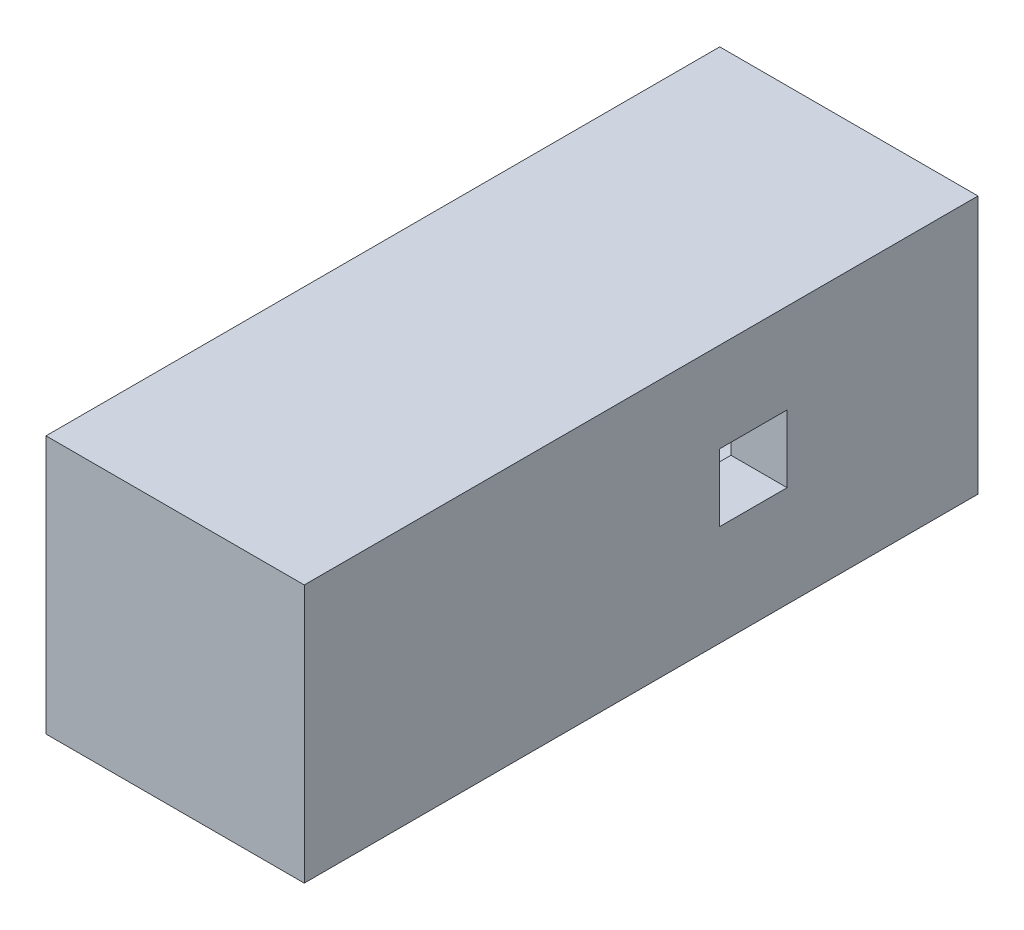
ISO-10303-21;
HEADER;
FILE_DESCRIPTION(('STEP AP214'),'2;1');
FILE_NAME('part.step','',(''),(''),'','','');
FILE_SCHEMA(('AUTOMOTIVE_DESIGN { 1 0 10303 214 1 1 1 1 }'));
ENDSEC;
DATA;
#1=APPLICATION_CONTEXT('core data for automotive mechanical design processes');
#2=APPLICATION_PROTOCOL_DEFINITION('international standard','automotive_design',2000,#1);
#3=PRODUCT_CONTEXT('',#1,'mechanical');
#4=PRODUCT('Part','Part','',(#3));
#5=PRODUCT_RELATED_PRODUCT_CATEGORY('part','',(#4));
#6=PRODUCT_DEFINITION_FORMATION('','',#4);
#7=PRODUCT_DEFINITION_CONTEXT('part definition',#1,'design');
#8=PRODUCT_DEFINITION('design','',#6,#7);
#9=PRODUCT_DEFINITION_SHAPE('','',#8);
#10=(LENGTH_UNIT() NAMED_UNIT(*) SI_UNIT(.MILLI.,.METRE.));
#11=(NAMED_UNIT(*) PLANE_ANGLE_UNIT() SI_UNIT($,.RADIAN.));
#12=(NAMED_UNIT(*) SI_UNIT($,.STERADIAN.) SOLID_ANGLE_UNIT());
#13=UNCERTAINTY_MEASURE_WITH_UNIT(LENGTH_MEASURE(1.E-05),#10,'distance_accuracy_value','');
#14=(GEOMETRIC_REPRESENTATION_CONTEXT(3) GLOBAL_UNCERTAINTY_ASSIGNED_CONTEXT((#13)) GLOBAL_UNIT_ASSIGNED_CONTEXT((#10,
#11,#12)) REPRESENTATION_CONTEXT('',''));
#15=CARTESIAN_POINT('',(0.,0.,0.));
#16=DIRECTION('',(0.,0.,1.));
#17=DIRECTION('',(1.,0.,0.));
#18=AXIS2_PLACEMENT_3D('',#15,#16,#17);
#19=CARTESIAN_POINT('',(0.,0.,0.));
#20=DIRECTION('',(0.,0.,1.));
#21=DIRECTION('',(1.,0.,0.));
#22=AXIS2_PLACEMENT_3D('',#19,#20,#21);
#23=PLANE('',#22);
#24=DIRECTION('',(0.,1.,0.));
#25=VECTOR('',#24,1.);
#26=CARTESIAN_POINT('',(0.,0.,0.));
#27=LINE('',#26,#25);
#28=CARTESIAN_POINT('',(0.,0.,0.));
#29=VERTEX_POINT('',#28);
#30=CARTESIAN_POINT('',(0.,23.,0.));
#31=VERTEX_POINT('',#30);
#32=EDGE_CURVE('E262',#29,#31,#27,.T.);
#33=ORIENTED_EDGE('',*,*,#32,.F.);
#34=DIRECTION('',(1.,0.,0.));
#35=VECTOR('',#34,1.);
#36=CARTESIAN_POINT('',(0.,0.,0.));
#37=LINE('',#36,#35);
#38=CARTESIAN_POINT('',(-23.,0.,0.));
#39=VERTEX_POINT('',#38);
#40=EDGE_CURVE('E269',#39,#29,#37,.T.);
#41=ORIENTED_EDGE('',*,*,#40,.F.);
#42=DIRECTION('',(0.,-1.,0.));
#43=VECTOR('',#42,1.);
#44=CARTESIAN_POINT('',(-23.,0.,0.));
#45=LINE('',#44,#43);
#46=CARTESIAN_POINT('',(-23.,23.,0.));
#47=VERTEX_POINT('',#46);
#48=EDGE_CURVE('E267',#47,#39,#45,.T.);
#49=ORIENTED_EDGE('',*,*,#48,.F.);
#50=DIRECTION('',(-1.,0.,0.));
#51=VECTOR('',#50,1.);
#52=CARTESIAN_POINT('',(0.,23.,0.));
#53=LINE('',#52,#51);
#54=EDGE_CURVE('E265',#31,#47,#53,.T.);
#55=ORIENTED_EDGE('',*,*,#54,.F.);
#56=EDGE_LOOP('',(#33,#41,#49,#55));
#57=FACE_BOUND('',#56,.T.);
#58=DIRECTION('',(0.,1.,0.));
#59=VECTOR('',#58,1.);
#60=CARTESIAN_POINT('',(-5.,5.,0.));
#61=LINE('',#60,#59);
#62=CARTESIAN_POINT('',(-5.,5.,0.));
#63=VERTEX_POINT('',#62);
#64=CARTESIAN_POINT('',(-5.,18.,0.));
#65=VERTEX_POINT('',#64);
#66=EDGE_CURVE('E228',#63,#65,#61,.T.);
#67=ORIENTED_EDGE('',*,*,#66,.T.);
#68=DIRECTION('',(-1.,0.,0.));
#69=VECTOR('',#68,1.);
#70=CARTESIAN_POINT('',(-5.,18.,0.));
#71=LINE('',#70,#69);
#72=CARTESIAN_POINT('',(-18.,18.,0.));
#73=VERTEX_POINT('',#72);
#74=EDGE_CURVE('E245',#65,#73,#71,.T.);
#75=ORIENTED_EDGE('',*,*,#74,.T.);
#76=DIRECTION('',(0.,-1.,0.));
#77=VECTOR('',#76,1.);
#78=CARTESIAN_POINT('',(-18.,5.,0.));
#79=LINE('',#78,#77);
#80=CARTESIAN_POINT('',(-18.,5.,0.));
#81=VERTEX_POINT('',#80);
#82=EDGE_CURVE('E248',#73,#81,#79,.T.);
#83=ORIENTED_EDGE('',*,*,#82,.T.);
#84=DIRECTION('',(1.,0.,0.));
#85=VECTOR('',#84,1.);
#86=CARTESIAN_POINT('',(-5.,5.,0.));
#87=LINE('',#86,#85);
#88=EDGE_CURVE('E233',#81,#63,#87,.T.);
#89=ORIENTED_EDGE('',*,*,#88,.T.);
#90=EDGE_LOOP('',(#67,#75,#83,#89));
#91=FACE_BOUND('',#90,.T.);
#92=ADVANCED_FACE('F35',(#57,#91),#23,.F.);
#93=CARTESIAN_POINT('',(0.,0.,33.));
#94=DIRECTION('',(-1.,0.,0.));
#95=DIRECTION('',(0.,0.,1.));
#96=AXIS2_PLACEMENT_3D('',#93,#94,#95);
#97=PLANE('',#96);
#98=DIRECTION('',(0.,0.,-1.));
#99=VECTOR('',#98,1.);
#100=CARTESIAN_POINT('',(0.,9.,23.));
#101=LINE('',#100,#99);
#102=CARTESIAN_POINT('',(0.,9.,23.));
#103=VERTEX_POINT('',#102);
#104=CARTESIAN_POINT('',(0.,9.,17.));
#105=VERTEX_POINT('',#104);
#106=EDGE_CURVE('E200',#103,#105,#101,.T.);
#107=ORIENTED_EDGE('',*,*,#106,.F.);
#108=DIRECTION('',(0.,-1.,0.));
#109=VECTOR('',#108,1.);
#110=CARTESIAN_POINT('',(0.,15.,23.));
#111=LINE('',#110,#109);
#112=CARTESIAN_POINT('',(0.,15.,23.));
#113=VERTEX_POINT('',#112);
#114=EDGE_CURVE('E181',#113,#103,#111,.T.);
#115=ORIENTED_EDGE('',*,*,#114,.F.);
#116=DIRECTION('',(0.,0.,1.));
#117=VECTOR('',#116,1.);
#118=CARTESIAN_POINT('',(0.,15.,23.));
#119=LINE('',#118,#117);
#120=CARTESIAN_POINT('',(0.,15.,17.));
#121=VERTEX_POINT('',#120);
#122=EDGE_CURVE('E189',#121,#113,#119,.T.);
#123=ORIENTED_EDGE('',*,*,#122,.F.);
#124=DIRECTION('',(0.,1.,0.));
#125=VECTOR('',#124,1.);
#126=CARTESIAN_POINT('',(0.,15.,17.));
#127=LINE('',#126,#125);
#128=EDGE_CURVE('E203',#105,#121,#127,.T.);
#129=ORIENTED_EDGE('',*,*,#128,.F.);
#130=EDGE_LOOP('',(#107,#115,#123,#129));
#131=FACE_BOUND('',#130,.T.);
#132=ORIENTED_EDGE('',*,*,#32,.T.);
#133=DIRECTION('',(0.,0.,-1.));
#134=VECTOR('',#133,1.);
#135=CARTESIAN_POINT('',(0.,23.,33.));
#136=LINE('',#135,#134);
#137=CARTESIAN_POINT('',(0.,23.,60.));
#138=VERTEX_POINT('',#137);
#139=EDGE_CURVE('E11',#138,#31,#136,.T.);
#140=ORIENTED_EDGE('',*,*,#139,.F.);
#141=DIRECTION('',(0.,1.,0.));
#142=VECTOR('',#141,1.);
#143=CARTESIAN_POINT('',(0.,0.,60.));
#144=LINE('',#143,#142);
#145=CARTESIAN_POINT('',(0.,0.,60.));
#146=VERTEX_POINT('',#145);
#147=EDGE_CURVE('E219',#146,#138,#144,.T.);
#148=ORIENTED_EDGE('',*,*,#147,.F.);
#149=DIRECTION('',(0.,0.,-1.));
#150=VECTOR('',#149,1.);
#151=CARTESIAN_POINT('',(0.,0.,33.));
#152=LINE('',#151,#150);
#153=EDGE_CURVE('E271',#146,#29,#152,.T.);
#154=ORIENTED_EDGE('',*,*,#153,.T.);
#155=EDGE_LOOP('',(#132,#140,#148,#154));
#156=FACE_BOUND('',#155,.T.);
#157=ADVANCED_FACE('F37',(#131,#156),#97,.F.);
#158=CARTESIAN_POINT('',(0.,23.,33.));
#159=DIRECTION('',(0.,-1.,0.));
#160=DIRECTION('',(1.,0.,0.));
#161=AXIS2_PLACEMENT_3D('',#158,#159,#160);
#162=PLANE('',#161);
#163=ORIENTED_EDGE('',*,*,#54,.T.);
#164=DIRECTION('',(0.,0.,-1.));
#165=VECTOR('',#164,1.);
#166=CARTESIAN_POINT('',(-23.,23.,33.));
#167=LINE('',#166,#165);
#168=CARTESIAN_POINT('',(-23.,23.,60.));
#169=VERTEX_POINT('',#168);
#170=EDGE_CURVE('E43',#169,#47,#167,.T.);
#171=ORIENTED_EDGE('',*,*,#170,.F.);
#172=DIRECTION('',(-1.,0.,0.));
#173=VECTOR('',#172,1.);
#174=CARTESIAN_POINT('',(0.,23.,60.));
#175=LINE('',#174,#173);
#176=EDGE_CURVE('E222',#138,#169,#175,.T.);
#177=ORIENTED_EDGE('',*,*,#176,.F.);
#178=ORIENTED_EDGE('',*,*,#139,.T.);
#179=EDGE_LOOP('',(#163,#171,#177,#178));
#180=FACE_BOUND('',#179,.T.);
#181=ADVANCED_FACE('F294',(#180),#162,.F.);
#182=CARTESIAN_POINT('',(-23.,0.,33.));
#183=DIRECTION('',(1.,0.,0.));
#184=DIRECTION('',(0.,0.,-1.));
#185=AXIS2_PLACEMENT_3D('',#182,#183,#184);
#186=PLANE('',#185);
#187=DIRECTION('',(0.,0.,1.));
#188=VECTOR('',#187,1.);
#189=CARTESIAN_POINT('',(-23.,9.,19.));
#190=LINE('',#189,#188);
#191=CARTESIAN_POINT('',(-23.,9.,19.));
#192=VERTEX_POINT('',#191);
#193=CARTESIAN_POINT('',(-23.,9.,21.));
#194=VERTEX_POINT('',#193);
#195=EDGE_CURVE('E175',#192,#194,#190,.T.);
#196=ORIENTED_EDGE('',*,*,#195,.F.);
#197=DIRECTION('',(0.,-1.,0.));
#198=VECTOR('',#197,1.);
#199=CARTESIAN_POINT('',(-23.,15.,19.));
#200=LINE('',#199,#198);
#201=CARTESIAN_POINT('',(-23.,15.,19.));
#202=VERTEX_POINT('',#201);
#203=EDGE_CURVE('E50',#202,#192,#200,.T.);
#204=ORIENTED_EDGE('',*,*,#203,.F.);
#205=DIRECTION('',(0.,0.,-1.));
#206=VECTOR('',#205,1.);
#207=CARTESIAN_POINT('',(-23.,15.,19.));
#208=LINE('',#207,#206);
#209=CARTESIAN_POINT('',(-23.,15.,21.));
#210=VERTEX_POINT('',#209);
#211=EDGE_CURVE('E166',#210,#202,#208,.T.);
#212=ORIENTED_EDGE('',*,*,#211,.F.);
#213=DIRECTION('',(0.,1.,0.));
#214=VECTOR('',#213,1.);
#215=CARTESIAN_POINT('',(-23.,15.,21.));
#216=LINE('',#215,#214);
#217=EDGE_CURVE('E169',#194,#210,#216,.T.);
#218=ORIENTED_EDGE('',*,*,#217,.F.);
#219=EDGE_LOOP('',(#196,#204,#212,#218));
#220=FACE_BOUND('',#219,.T.);
#221=ORIENTED_EDGE('',*,*,#48,.T.);
#222=DIRECTION('',(0.,0.,-1.));
#223=VECTOR('',#222,1.);
#224=CARTESIAN_POINT('',(-23.,0.,33.));
#225=LINE('',#224,#223);
#226=CARTESIAN_POINT('',(-23.,0.,60.));
#227=VERTEX_POINT('',#226);
#228=EDGE_CURVE('E274',#227,#39,#225,.T.);
#229=ORIENTED_EDGE('',*,*,#228,.F.);
#230=DIRECTION('',(0.,-1.,0.));
#231=VECTOR('',#230,1.);
#232=CARTESIAN_POINT('',(-23.,23.,60.));
#233=LINE('',#232,#231);
#234=EDGE_CURVE('E225',#169,#227,#233,.T.);
#235=ORIENTED_EDGE('',*,*,#234,.F.);
#236=ORIENTED_EDGE('',*,*,#170,.T.);
#237=EDGE_LOOP('',(#221,#229,#235,#236));
#238=FACE_BOUND('',#237,.T.);
#239=ADVANCED_FACE('F280',(#220,#238),#186,.F.);
#240=CARTESIAN_POINT('',(0.,0.,33.));
#241=DIRECTION('',(0.,1.,0.));
#242=DIRECTION('',(0.,0.,1.));
#243=AXIS2_PLACEMENT_3D('',#240,#241,#242);
#244=PLANE('',#243);
#245=ORIENTED_EDGE('',*,*,#40,.T.);
#246=ORIENTED_EDGE('',*,*,#153,.F.);
#247=DIRECTION('',(1.,0.,0.));
#248=VECTOR('',#247,1.);
#249=CARTESIAN_POINT('',(-23.,0.,60.));
#250=LINE('',#249,#248);
#251=EDGE_CURVE('E210',#227,#146,#250,.T.);
#252=ORIENTED_EDGE('',*,*,#251,.F.);
#253=ORIENTED_EDGE('',*,*,#228,.T.);
#254=EDGE_LOOP('',(#245,#246,#252,#253));
#255=FACE_BOUND('',#254,.T.);
#256=ADVANCED_FACE('F288',(#255),#244,.F.);
#257=CARTESIAN_POINT('',(-5.,5.,33.));
#258=DIRECTION('',(-1.,0.,0.));
#259=DIRECTION('',(0.,-1.,0.));
#260=AXIS2_PLACEMENT_3D('',#257,#258,#259);
#261=PLANE('',#260);
#262=DIRECTION('',(0.,-1.,0.));
#263=VECTOR('',#262,1.);
#264=CARTESIAN_POINT('',(-5.,15.,23.));
#265=LINE('',#264,#263);
#266=CARTESIAN_POINT('',(-5.,15.,23.));
#267=VERTEX_POINT('',#266);
#268=CARTESIAN_POINT('',(-5.,9.,23.));
#269=VERTEX_POINT('',#268);
#270=EDGE_CURVE('E185',#267,#269,#265,.T.);
#271=ORIENTED_EDGE('',*,*,#270,.T.);
#272=DIRECTION('',(0.,0.,-1.));
#273=VECTOR('',#272,1.);
#274=CARTESIAN_POINT('',(-5.,9.,23.));
#275=LINE('',#274,#273);
#276=CARTESIAN_POINT('',(-5.,9.,17.));
#277=VERTEX_POINT('',#276);
#278=EDGE_CURVE('E188',#269,#277,#275,.T.);
#279=ORIENTED_EDGE('',*,*,#278,.T.);
#280=DIRECTION('',(0.,1.,0.));
#281=VECTOR('',#280,1.);
#282=CARTESIAN_POINT('',(-5.,15.,17.));
#283=LINE('',#282,#281);
#284=CARTESIAN_POINT('',(-5.,15.,17.));
#285=VERTEX_POINT('',#284);
#286=EDGE_CURVE('E192',#277,#285,#283,.T.);
#287=ORIENTED_EDGE('',*,*,#286,.T.);
#288=DIRECTION('',(0.,0.,1.));
#289=VECTOR('',#288,1.);
#290=CARTESIAN_POINT('',(-5.,15.,23.));
#291=LINE('',#290,#289);
#292=EDGE_CURVE('E195',#285,#267,#291,.T.);
#293=ORIENTED_EDGE('',*,*,#292,.T.);
#294=EDGE_LOOP('',(#271,#279,#287,#293));
#295=FACE_BOUND('',#294,.T.);
#296=ORIENTED_EDGE('',*,*,#66,.F.);
#297=DIRECTION('',(0.,0.,-1.));
#298=VECTOR('',#297,1.);
#299=CARTESIAN_POINT('',(-5.,5.,33.));
#300=LINE('',#299,#298);
#301=CARTESIAN_POINT('',(-5.,5.,33.));
#302=VERTEX_POINT('',#301);
#303=EDGE_CURVE('E242',#302,#63,#300,.T.);
#304=ORIENTED_EDGE('',*,*,#303,.F.);
#305=DIRECTION('',(0.,1.,0.));
#306=VECTOR('',#305,1.);
#307=CARTESIAN_POINT('',(-5.,5.,33.));
#308=LINE('',#307,#306);
#309=CARTESIAN_POINT('',(-5.,18.,33.));
#310=VERTEX_POINT('',#309);
#311=EDGE_CURVE('E229',#302,#310,#308,.T.);
#312=ORIENTED_EDGE('',*,*,#311,.T.);
#313=DIRECTION('',(0.,0.,-1.));
#314=VECTOR('',#313,1.);
#315=CARTESIAN_POINT('',(-5.,18.,33.));
#316=LINE('',#315,#314);
#317=EDGE_CURVE('E259',#310,#65,#316,.T.);
#318=ORIENTED_EDGE('',*,*,#317,.T.);
#319=EDGE_LOOP('',(#296,#304,#312,#318));
#320=FACE_BOUND('',#319,.T.);
#321=ADVANCED_FACE('F309',(#295,#320),#261,.T.);
#322=CARTESIAN_POINT('',(-5.,18.,33.));
#323=DIRECTION('',(0.,-1.,0.));
#324=DIRECTION('',(1.,0.,0.));
#325=AXIS2_PLACEMENT_3D('',#322,#323,#324);
#326=PLANE('',#325);
#327=ORIENTED_EDGE('',*,*,#74,.F.);
#328=ORIENTED_EDGE('',*,*,#317,.F.);
#329=DIRECTION('',(-1.,0.,0.));
#330=VECTOR('',#329,1.);
#331=CARTESIAN_POINT('',(-5.,18.,33.));
#332=LINE('',#331,#330);
#333=CARTESIAN_POINT('',(-18.,18.,33.));
#334=VERTEX_POINT('',#333);
#335=EDGE_CURVE('E232',#310,#334,#332,.T.);
#336=ORIENTED_EDGE('',*,*,#335,.T.);
#337=DIRECTION('',(0.,0.,-1.));
#338=VECTOR('',#337,1.);
#339=CARTESIAN_POINT('',(-18.,18.,33.));
#340=LINE('',#339,#338);
#341=EDGE_CURVE('E257',#334,#73,#340,.T.);
#342=ORIENTED_EDGE('',*,*,#341,.T.);
#343=EDGE_LOOP('',(#327,#328,#336,#342));
#344=FACE_BOUND('',#343,.T.);
#345=ADVANCED_FACE('F315',(#344),#326,.T.);
#346=CARTESIAN_POINT('',(-18.,5.,33.));
#347=DIRECTION('',(1.,0.,0.));
#348=DIRECTION('',(0.,0.,-1.));
#349=AXIS2_PLACEMENT_3D('',#346,#347,#348);
#350=PLANE('',#349);
#351=DIRECTION('',(0.,-1.,0.));
#352=VECTOR('',#351,1.);
#353=CARTESIAN_POINT('',(-18.,15.,19.));
#354=LINE('',#353,#352);
#355=CARTESIAN_POINT('',(-18.,15.,19.));
#356=VERTEX_POINT('',#355);
#357=CARTESIAN_POINT('',(-18.,9.,19.));
#358=VERTEX_POINT('',#357);
#359=EDGE_CURVE('E150',#356,#358,#354,.T.);
#360=ORIENTED_EDGE('',*,*,#359,.T.);
#361=DIRECTION('',(0.,0.,1.));
#362=VECTOR('',#361,1.);
#363=CARTESIAN_POINT('',(-18.,9.,19.));
#364=LINE('',#363,#362);
#365=CARTESIAN_POINT('',(-18.,9.,21.));
#366=VERTEX_POINT('',#365);
#367=EDGE_CURVE('E159',#358,#366,#364,.T.);
#368=ORIENTED_EDGE('',*,*,#367,.T.);
#369=DIRECTION('',(0.,1.,0.));
#370=VECTOR('',#369,1.);
#371=CARTESIAN_POINT('',(-18.,15.,21.));
#372=LINE('',#371,#370);
#373=CARTESIAN_POINT('',(-18.,15.,21.));
#374=VERTEX_POINT('',#373);
#375=EDGE_CURVE('E58',#366,#374,#372,.T.);
#376=ORIENTED_EDGE('',*,*,#375,.T.);
#377=DIRECTION('',(0.,0.,-1.));
#378=VECTOR('',#377,1.);
#379=CARTESIAN_POINT('',(-18.,15.,19.));
#380=LINE('',#379,#378);
#381=EDGE_CURVE('E156',#374,#356,#380,.T.);
#382=ORIENTED_EDGE('',*,*,#381,.T.);
#383=EDGE_LOOP('',(#360,#368,#376,#382));
#384=FACE_BOUND('',#383,.T.);
#385=ORIENTED_EDGE('',*,*,#82,.F.);
#386=ORIENTED_EDGE('',*,*,#341,.F.);
#387=DIRECTION('',(0.,-1.,0.));
#388=VECTOR('',#387,1.);
#389=CARTESIAN_POINT('',(-18.,5.,33.));
#390=LINE('',#389,#388);
#391=CARTESIAN_POINT('',(-18.,5.,33.));
#392=VERTEX_POINT('',#391);
#393=EDGE_CURVE('E236',#334,#392,#390,.T.);
#394=ORIENTED_EDGE('',*,*,#393,.T.);
#395=DIRECTION('',(0.,0.,-1.));
#396=VECTOR('',#395,1.);
#397=CARTESIAN_POINT('',(-18.,5.,33.));
#398=LINE('',#397,#396);
#399=EDGE_CURVE('E255',#392,#81,#398,.T.);
#400=ORIENTED_EDGE('',*,*,#399,.T.);
#401=EDGE_LOOP('',(#385,#386,#394,#400));
#402=FACE_BOUND('',#401,.T.);
#403=ADVANCED_FACE('F163',(#384,#402),#350,.T.);
#404=CARTESIAN_POINT('',(-5.,5.,33.));
#405=DIRECTION('',(0.,1.,0.));
#406=DIRECTION('',(-1.,0.,0.));
#407=AXIS2_PLACEMENT_3D('',#404,#405,#406);
#408=PLANE('',#407);
#409=ORIENTED_EDGE('',*,*,#88,.F.);
#410=ORIENTED_EDGE('',*,*,#399,.F.);
#411=DIRECTION('',(1.,0.,0.));
#412=VECTOR('',#411,1.);
#413=CARTESIAN_POINT('',(-5.,5.,33.));
#414=LINE('',#413,#412);
#415=EDGE_CURVE('E239',#392,#302,#414,.T.);
#416=ORIENTED_EDGE('',*,*,#415,.T.);
#417=ORIENTED_EDGE('',*,*,#303,.T.);
#418=EDGE_LOOP('',(#409,#410,#416,#417));
#419=FACE_BOUND('',#418,.T.);
#420=ADVANCED_FACE('F327',(#419),#408,.T.);
#421=CARTESIAN_POINT('',(0.,0.,33.));
#422=DIRECTION('',(0.,0.,1.));
#423=DIRECTION('',(1.,0.,0.));
#424=AXIS2_PLACEMENT_3D('',#421,#422,#423);
#425=PLANE('',#424);
#426=ORIENTED_EDGE('',*,*,#335,.F.);
#427=ORIENTED_EDGE('',*,*,#311,.F.);
#428=ORIENTED_EDGE('',*,*,#415,.F.);
#429=ORIENTED_EDGE('',*,*,#393,.F.);
#430=EDGE_LOOP('',(#426,#427,#428,#429));
#431=FACE_BOUND('',#430,.T.);
#432=ADVANCED_FACE('F332',(#431),#425,.F.);
#433=CARTESIAN_POINT('',(0.,0.,60.));
#434=DIRECTION('',(0.,0.,1.));
#435=DIRECTION('',(1.,0.,0.));
#436=AXIS2_PLACEMENT_3D('',#433,#434,#435);
#437=PLANE('',#436);
#438=ORIENTED_EDGE('',*,*,#251,.T.);
#439=ORIENTED_EDGE('',*,*,#147,.T.);
#440=ORIENTED_EDGE('',*,*,#176,.T.);
#441=ORIENTED_EDGE('',*,*,#234,.T.);
#442=EDGE_LOOP('',(#438,#439,#440,#441));
#443=FACE_BOUND('',#442,.T.);
#444=ADVANCED_FACE('F293',(#443),#437,.T.);
#445=CARTESIAN_POINT('',(-5.,15.,23.));
#446=DIRECTION('',(0.,0.,1.));
#447=DIRECTION('',(1.,0.,0.));
#448=AXIS2_PLACEMENT_3D('',#445,#446,#447);
#449=PLANE('',#448);
#450=ORIENTED_EDGE('',*,*,#114,.T.);
#451=DIRECTION('',(1.,0.,0.));
#452=VECTOR('',#451,1.);
#453=CARTESIAN_POINT('',(-5.,9.,23.));
#454=LINE('',#453,#452);
#455=EDGE_CURVE('E198',#269,#103,#454,.T.);
#456=ORIENTED_EDGE('',*,*,#455,.F.);
#457=ORIENTED_EDGE('',*,*,#270,.F.);
#458=DIRECTION('',(1.,0.,0.));
#459=VECTOR('',#458,1.);
#460=CARTESIAN_POINT('',(-5.,15.,23.));
#461=LINE('',#460,#459);
#462=EDGE_CURVE('E208',#267,#113,#461,.T.);
#463=ORIENTED_EDGE('',*,*,#462,.T.);
#464=EDGE_LOOP('',(#450,#456,#457,#463));
#465=FACE_BOUND('',#464,.T.);
#466=ADVANCED_FACE('F339',(#465),#449,.F.);
#467=CARTESIAN_POINT('',(-5.,15.,23.));
#468=DIRECTION('',(0.,1.,0.));
#469=DIRECTION('',(0.,0.,1.));
#470=AXIS2_PLACEMENT_3D('',#467,#468,#469);
#471=PLANE('',#470);
#472=ORIENTED_EDGE('',*,*,#122,.T.);
#473=ORIENTED_EDGE('',*,*,#462,.F.);
#474=ORIENTED_EDGE('',*,*,#292,.F.);
#475=DIRECTION('',(1.,0.,0.));
#476=VECTOR('',#475,1.);
#477=CARTESIAN_POINT('',(-5.,15.,17.));
#478=LINE('',#477,#476);
#479=EDGE_CURVE('E211',#285,#121,#478,.T.);
#480=ORIENTED_EDGE('',*,*,#479,.T.);
#481=EDGE_LOOP('',(#472,#473,#474,#480));
#482=FACE_BOUND('',#481,.T.);
#483=ADVANCED_FACE('F390',(#482),#471,.F.);
#484=CARTESIAN_POINT('',(-5.,15.,17.));
#485=DIRECTION('',(0.,0.,-1.));
#486=DIRECTION('',(0.,1.,0.));
#487=AXIS2_PLACEMENT_3D('',#484,#485,#486);
#488=PLANE('',#487);
#489=ORIENTED_EDGE('',*,*,#128,.T.);
#490=ORIENTED_EDGE('',*,*,#479,.F.);
#491=ORIENTED_EDGE('',*,*,#286,.F.);
#492=DIRECTION('',(1.,0.,0.));
#493=VECTOR('',#492,1.);
#494=CARTESIAN_POINT('',(-5.,9.,17.));
#495=LINE('',#494,#493);
#496=EDGE_CURVE('E213',#277,#105,#495,.T.);
#497=ORIENTED_EDGE('',*,*,#496,.T.);
#498=EDGE_LOOP('',(#489,#490,#491,#497));
#499=FACE_BOUND('',#498,.T.);
#500=ADVANCED_FACE('F399',(#499),#488,.F.);
#501=CARTESIAN_POINT('',(-5.,9.,23.));
#502=DIRECTION('',(0.,-1.,0.));
#503=DIRECTION('',(0.,0.,-1.));
#504=AXIS2_PLACEMENT_3D('',#501,#502,#503);
#505=PLANE('',#504);
#506=ORIENTED_EDGE('',*,*,#106,.T.);
#507=ORIENTED_EDGE('',*,*,#496,.F.);
#508=ORIENTED_EDGE('',*,*,#278,.F.);
#509=ORIENTED_EDGE('',*,*,#455,.T.);
#510=EDGE_LOOP('',(#506,#507,#508,#509));
#511=FACE_BOUND('',#510,.T.);
#512=ADVANCED_FACE('F409',(#511),#505,.F.);
#513=CARTESIAN_POINT('',(-18.,15.,19.));
#514=DIRECTION('',(0.,0.,-1.));
#515=DIRECTION('',(-1.,0.,0.));
#516=AXIS2_PLACEMENT_3D('',#513,#514,#515);
#517=PLANE('',#516);
#518=ORIENTED_EDGE('',*,*,#203,.T.);
#519=DIRECTION('',(-1.,0.,0.));
#520=VECTOR('',#519,1.);
#521=CARTESIAN_POINT('',(-18.,9.,19.));
#522=LINE('',#521,#520);
#523=EDGE_CURVE('E146',#358,#192,#522,.T.);
#524=ORIENTED_EDGE('',*,*,#523,.F.);
#525=ORIENTED_EDGE('',*,*,#359,.F.);
#526=DIRECTION('',(-1.,0.,0.));
#527=VECTOR('',#526,1.);
#528=CARTESIAN_POINT('',(-18.,15.,19.));
#529=LINE('',#528,#527);
#530=EDGE_CURVE('E179',#356,#202,#529,.T.);
#531=ORIENTED_EDGE('',*,*,#530,.T.);
#532=EDGE_LOOP('',(#518,#524,#525,#531));
#533=FACE_BOUND('',#532,.T.);
#534=ADVANCED_FACE('F148',(#533),#517,.F.);
#535=CARTESIAN_POINT('',(-18.,15.,19.));
#536=DIRECTION('',(0.,1.,0.));
#537=DIRECTION('',(0.,0.,1.));
#538=AXIS2_PLACEMENT_3D('',#535,#536,#537);
#539=PLANE('',#538);
#540=ORIENTED_EDGE('',*,*,#211,.T.);
#541=ORIENTED_EDGE('',*,*,#530,.F.);
#542=ORIENTED_EDGE('',*,*,#381,.F.);
#543=DIRECTION('',(-1.,0.,0.));
#544=VECTOR('',#543,1.);
#545=CARTESIAN_POINT('',(-18.,15.,21.));
#546=LINE('',#545,#544);
#547=EDGE_CURVE('E182',#374,#210,#546,.T.);
#548=ORIENTED_EDGE('',*,*,#547,.T.);
#549=EDGE_LOOP('',(#540,#541,#542,#548));
#550=FACE_BOUND('',#549,.T.);
#551=ADVANCED_FACE('F452',(#550),#539,.F.);
#552=CARTESIAN_POINT('',(-18.,15.,21.));
#553=DIRECTION('',(0.,0.,1.));
#554=DIRECTION('',(0.,-1.,0.));
#555=AXIS2_PLACEMENT_3D('',#552,#553,#554);
#556=PLANE('',#555);
#557=ORIENTED_EDGE('',*,*,#217,.T.);
#558=ORIENTED_EDGE('',*,*,#547,.F.);
#559=ORIENTED_EDGE('',*,*,#375,.F.);
#560=DIRECTION('',(-1.,0.,0.));
#561=VECTOR('',#560,1.);
#562=CARTESIAN_POINT('',(-18.,9.,21.));
#563=LINE('',#562,#561);
#564=EDGE_CURVE('E155',#366,#194,#563,.T.);
#565=ORIENTED_EDGE('',*,*,#564,.T.);
#566=EDGE_LOOP('',(#557,#558,#559,#565));
#567=FACE_BOUND('',#566,.T.);
#568=ADVANCED_FACE('F458',(#567),#556,.F.);
#569=CARTESIAN_POINT('',(-18.,9.,19.));
#570=DIRECTION('',(0.,-1.,0.));
#571=DIRECTION('',(0.,0.,-1.));
#572=AXIS2_PLACEMENT_3D('',#569,#570,#571);
#573=PLANE('',#572);
#574=ORIENTED_EDGE('',*,*,#195,.T.);
#575=ORIENTED_EDGE('',*,*,#564,.F.);
#576=ORIENTED_EDGE('',*,*,#367,.F.);
#577=ORIENTED_EDGE('',*,*,#523,.T.);
#578=EDGE_LOOP('',(#574,#575,#576,#577));
#579=FACE_BOUND('',#578,.T.);
#580=ADVANCED_FACE('F160',(#579),#573,.F.);
#581=CLOSED_SHELL('',(#92,#157,#181,#239,#256,#321,#345,#403,#420,#432,#444,#466,#483,#500,#512,
#534,#551,#568,#580));
#582=MANIFOLD_SOLID_BREP('B2',#581);
#583=ADVANCED_BREP_SHAPE_REPRESENTATION('',(#18,#582),#14);
#584=SHAPE_DEFINITION_REPRESENTATION(#9,#583);
ENDSEC;
END-ISO-10303-21;
